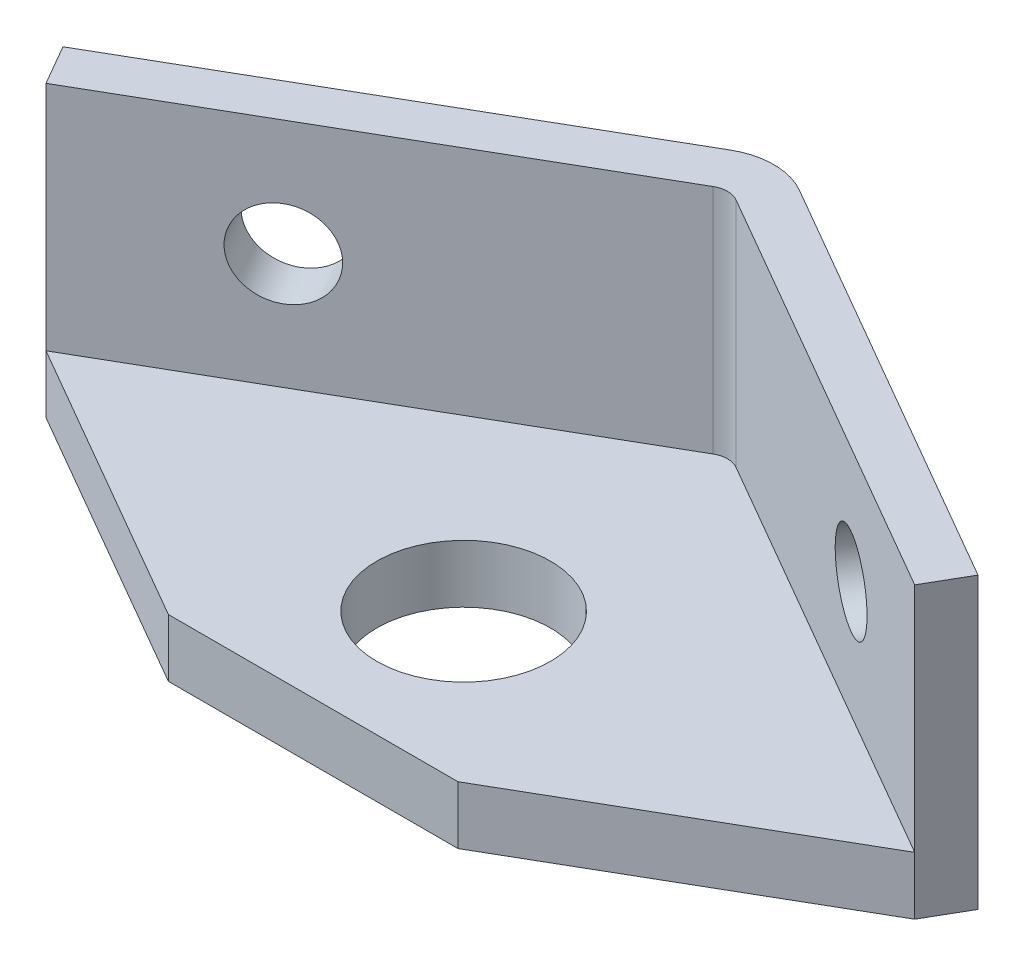
ISO-10303-21;
HEADER;
FILE_DESCRIPTION(('STEP AP214'),'2;1');
FILE_NAME('part.step','',(''),(''),'','','');
FILE_SCHEMA(('AUTOMOTIVE_DESIGN { 1 0 10303 214 1 1 1 1 }'));
ENDSEC;
DATA;
#1=APPLICATION_CONTEXT('core data for automotive mechanical design processes');
#2=APPLICATION_PROTOCOL_DEFINITION('international standard','automotive_design',2000,#1);
#3=PRODUCT_CONTEXT('',#1,'mechanical');
#4=PRODUCT('Part','Part','',(#3));
#5=PRODUCT_RELATED_PRODUCT_CATEGORY('part','',(#4));
#6=PRODUCT_DEFINITION_FORMATION('','',#4);
#7=PRODUCT_DEFINITION_CONTEXT('part definition',#1,'design');
#8=PRODUCT_DEFINITION('design','',#6,#7);
#9=PRODUCT_DEFINITION_SHAPE('','',#8);
#10=(LENGTH_UNIT() NAMED_UNIT(*) SI_UNIT(.MILLI.,.METRE.));
#11=(NAMED_UNIT(*) PLANE_ANGLE_UNIT() SI_UNIT($,.RADIAN.));
#12=(NAMED_UNIT(*) SI_UNIT($,.STERADIAN.) SOLID_ANGLE_UNIT());
#13=UNCERTAINTY_MEASURE_WITH_UNIT(LENGTH_MEASURE(1.E-05),#10,'distance_accuracy_value','');
#14=(GEOMETRIC_REPRESENTATION_CONTEXT(3) GLOBAL_UNCERTAINTY_ASSIGNED_CONTEXT((#13)) GLOBAL_UNIT_ASSIGNED_CONTEXT((#10,
#11,#12)) REPRESENTATION_CONTEXT('',''));
#15=CARTESIAN_POINT('',(0.,0.,0.));
#16=DIRECTION('',(0.,0.,1.));
#17=DIRECTION('',(1.,0.,0.));
#18=AXIS2_PLACEMENT_3D('',#15,#16,#17);
#19=CARTESIAN_POINT('',(-20.,50.,-34.6410161513775));
#20=DIRECTION('',(0.500000000000001,0.,0.866025403784438));
#21=DIRECTION('',(0.866025403784438,0.,-0.500000000000001));
#22=AXIS2_PLACEMENT_3D('',#19,#20,#21);
#23=PLANE('',#22);
#24=CARTESIAN_POINT('',(-49.0192378864667,30.,-17.8867513459482));
#25=DIRECTION('',(0.500000000000001,0.,0.866025403784438));
#26=DIRECTION('',(0.866025403784438,0.,-0.500000000000001));
#27=AXIS2_PLACEMENT_3D('',#24,#25,#26);
#28=CIRCLE('',#27,7.5);
#29=CARTESIAN_POINT('',(-42.5240473580834,30.,-21.6367513459482));
#30=VERTEX_POINT('',#29);
#31=EDGE_CURVE('E225',#30,#30,#28,.T.);
#32=ORIENTED_EDGE('',*,*,#31,.F.);
#33=EDGE_LOOP('',(#32));
#34=FACE_BOUND('',#33,.T.);
#35=DIRECTION('',(-0.866025403784438,0.,0.500000000000001));
#36=VECTOR('',#35,1.);
#37=CARTESIAN_POINT('',(-20.,10.,-34.6410161513775));
#38=LINE('',#37,#36);
#39=CARTESIAN_POINT('',(-2.00000000000001,10.,-45.0333209967908));
#40=VERTEX_POINT('',#39);
#41=CARTESIAN_POINT('',(-74.9999999999998,10.,-2.88675134594812));
#42=VERTEX_POINT('',#41);
#43=EDGE_CURVE('E188',#40,#42,#38,.T.);
#44=ORIENTED_EDGE('',*,*,#43,.F.);
#45=DIRECTION('',(0.,-1.,0.));
#46=VECTOR('',#45,1.);
#47=CARTESIAN_POINT('',(-2.00000000000001,50.,-45.0333209967908));
#48=LINE('',#47,#46);
#49=CARTESIAN_POINT('',(-2.00000000000001,50.,-45.0333209967908));
#50=VERTEX_POINT('',#49);
#51=EDGE_CURVE('E11',#50,#40,#48,.T.);
#52=ORIENTED_EDGE('',*,*,#51,.F.);
#53=DIRECTION('',(-0.866025403784438,0.,0.500000000000001));
#54=VECTOR('',#53,1.);
#55=CARTESIAN_POINT('',(-20.,50.,-34.6410161513775));
#56=LINE('',#55,#54);
#57=CARTESIAN_POINT('',(-74.9999999999998,50.,-2.88675134594812));
#58=VERTEX_POINT('',#57);
#59=EDGE_CURVE('E152',#50,#58,#56,.T.);
#60=ORIENTED_EDGE('',*,*,#59,.T.);
#61=DIRECTION('',(0.,-1.,0.));
#62=VECTOR('',#61,1.);
#63=CARTESIAN_POINT('',(-74.9999999999998,50.,-2.88675134594812));
#64=LINE('',#63,#62);
#65=EDGE_CURVE('E58',#58,#42,#64,.T.);
#66=ORIENTED_EDGE('',*,*,#65,.T.);
#67=EDGE_LOOP('',(#44,#52,#60,#66));
#68=FACE_BOUND('',#67,.T.);
#69=ADVANCED_FACE('F41',(#34,#68),#23,.T.);
#70=CARTESIAN_POINT('',(0.,50.,-41.5692193816531));
#71=DIRECTION('',(0.,-1.,0.));
#72=DIRECTION('',(0.,0.,-1.));
#73=AXIS2_PLACEMENT_3D('',#70,#71,#72);
#74=CYLINDRICAL_SURFACE('',#73,4.);
#75=ORIENTED_EDGE('',*,*,#51,.T.);
#76=CARTESIAN_POINT('',(0.,10.,-41.5692193816531));
#77=DIRECTION('',(0.,1.,0.));
#78=DIRECTION('',(0.,0.,1.));
#79=AXIS2_PLACEMENT_3D('',#76,#77,#78);
#80=CIRCLE('',#79,4.);
#81=CARTESIAN_POINT('',(2.00000000000001,10.,-45.0333209967908));
#82=VERTEX_POINT('',#81);
#83=EDGE_CURVE('E183',#40,#82,#80,.F.);
#84=ORIENTED_EDGE('',*,*,#83,.T.);
#85=DIRECTION('',(0.,-1.,0.));
#86=VECTOR('',#85,1.);
#87=CARTESIAN_POINT('',(2.00000000000001,50.,-45.0333209967908));
#88=LINE('',#87,#86);
#89=CARTESIAN_POINT('',(2.00000000000001,50.,-45.0333209967908));
#90=VERTEX_POINT('',#89);
#91=EDGE_CURVE('E50',#90,#82,#88,.T.);
#92=ORIENTED_EDGE('',*,*,#91,.F.);
#93=CARTESIAN_POINT('',(0.,50.,-41.5692193816531));
#94=DIRECTION('',(0.,1.,0.));
#95=DIRECTION('',(0.,0.,1.));
#96=AXIS2_PLACEMENT_3D('',#93,#94,#95);
#97=CIRCLE('',#96,4.);
#98=EDGE_CURVE('E181',#50,#90,#97,.F.);
#99=ORIENTED_EDGE('',*,*,#98,.F.);
#100=EDGE_LOOP('',(#75,#84,#92,#99));
#101=FACE_BOUND('',#100,.T.);
#102=ADVANCED_FACE('F180',(#101),#74,.F.);
#103=CARTESIAN_POINT('',(20.,50.,-34.6410161513775));
#104=DIRECTION('',(-0.500000000000001,0.,0.866025403784438));
#105=DIRECTION('',(0.866025403784438,0.,0.500000000000001));
#106=AXIS2_PLACEMENT_3D('',#103,#104,#105);
#107=PLANE('',#106);
#108=CARTESIAN_POINT('',(49.0192378864667,30.,-17.8867513459482));
#109=DIRECTION('',(-0.500000000000001,0.,0.866025403784438));
#110=DIRECTION('',(0.866025403784438,0.,0.500000000000001));
#111=AXIS2_PLACEMENT_3D('',#108,#109,#110);
#112=CIRCLE('',#111,7.5);
#113=CARTESIAN_POINT('',(55.51442841485,30.,-14.1367513459482));
#114=VERTEX_POINT('',#113);
#115=EDGE_CURVE('E316',#114,#114,#112,.T.);
#116=ORIENTED_EDGE('',*,*,#115,.F.);
#117=EDGE_LOOP('',(#116));
#118=FACE_BOUND('',#117,.T.);
#119=DIRECTION('',(-0.866025403784438,0.,-0.500000000000001));
#120=VECTOR('',#119,1.);
#121=CARTESIAN_POINT('',(20.,10.,-34.6410161513775));
#122=LINE('',#121,#120);
#123=CARTESIAN_POINT('',(74.9999999999998,10.,-2.88675134594812));
#124=VERTEX_POINT('',#123);
#125=EDGE_CURVE('E174',#124,#82,#122,.T.);
#126=ORIENTED_EDGE('',*,*,#125,.F.);
#127=DIRECTION('',(0.,-1.,0.));
#128=VECTOR('',#127,1.);
#129=CARTESIAN_POINT('',(74.9999999999998,50.,-2.88675134594812));
#130=LINE('',#129,#128);
#131=CARTESIAN_POINT('',(74.9999999999998,50.,-2.88675134594812));
#132=VERTEX_POINT('',#131);
#133=EDGE_CURVE('E162',#132,#124,#130,.T.);
#134=ORIENTED_EDGE('',*,*,#133,.F.);
#135=DIRECTION('',(-0.866025403784438,0.,-0.500000000000001));
#136=VECTOR('',#135,1.);
#137=CARTESIAN_POINT('',(20.,50.,-34.6410161513775));
#138=LINE('',#137,#136);
#139=EDGE_CURVE('E176',#132,#90,#138,.T.);
#140=ORIENTED_EDGE('',*,*,#139,.T.);
#141=ORIENTED_EDGE('',*,*,#91,.T.);
#142=EDGE_LOOP('',(#126,#134,#140,#141));
#143=FACE_BOUND('',#142,.T.);
#144=ADVANCED_FACE('F171',(#118,#143),#107,.T.);
#145=CARTESIAN_POINT('',(54.9999999999998,50.,31.7542648054294));
#146=DIRECTION('',(0.866025403784438,0.,0.500000000000001));
#147=DIRECTION('',(0.500000000000001,0.,-0.866025403784438));
#148=AXIS2_PLACEMENT_3D('',#145,#146,#147);
#149=PLANE('',#148);
#150=DIRECTION('',(-0.500000000000001,0.,0.866025403784438));
#151=VECTOR('',#150,1.);
#152=CARTESIAN_POINT('',(54.9999999999998,0.,31.7542648054294));
#153=LINE('',#152,#151);
#154=CARTESIAN_POINT('',(78.9999999999999,0.,-9.81495457622361));
#155=VERTEX_POINT('',#154);
#156=CARTESIAN_POINT('',(74.9999999999998,0.,-2.88675134594812));
#157=VERTEX_POINT('',#156);
#158=EDGE_CURVE('E134',#155,#157,#153,.T.);
#159=ORIENTED_EDGE('',*,*,#158,.F.);
#160=DIRECTION('',(0.,-1.,0.));
#161=VECTOR('',#160,1.);
#162=CARTESIAN_POINT('',(78.9999999999999,50.,-9.81495457622361));
#163=LINE('',#162,#161);
#164=CARTESIAN_POINT('',(78.9999999999999,50.,-9.81495457622361));
#165=VERTEX_POINT('',#164);
#166=EDGE_CURVE('E159',#165,#155,#163,.T.);
#167=ORIENTED_EDGE('',*,*,#166,.F.);
#168=DIRECTION('',(-0.500000000000001,0.,0.866025403784438));
#169=VECTOR('',#168,1.);
#170=CARTESIAN_POINT('',(54.9999999999998,50.,31.7542648054294));
#171=LINE('',#170,#169);
#172=EDGE_CURVE('E252',#165,#132,#171,.T.);
#173=ORIENTED_EDGE('',*,*,#172,.T.);
#174=ORIENTED_EDGE('',*,*,#133,.T.);
#175=DIRECTION('',(0.,-1.,0.));
#176=VECTOR('',#175,1.);
#177=CARTESIAN_POINT('',(74.9999999999998,10.,-2.88675134594812));
#178=LINE('',#177,#176);
#179=EDGE_CURVE('E219',#124,#157,#178,.T.);
#180=ORIENTED_EDGE('',*,*,#179,.T.);
#181=EDGE_LOOP('',(#159,#167,#173,#174,#180));
#182=FACE_BOUND('',#181,.T.);
#183=ADVANCED_FACE('F292',(#182),#149,.T.);
#184=CARTESIAN_POINT('',(24.,50.,-41.569219381653));
#185=DIRECTION('',(0.500000000000001,0.,-0.866025403784438));
#186=DIRECTION('',(-0.866025403784438,0.,-0.500000000000001));
#187=AXIS2_PLACEMENT_3D('',#184,#185,#186);
#188=PLANE('',#187);
#189=CARTESIAN_POINT('',(53.0192378864667,30.,-24.8149545762236));
#190=DIRECTION('',(0.500000000000001,0.,-0.866025403784438));
#191=DIRECTION('',(-0.866025403784438,0.,-0.500000000000001));
#192=AXIS2_PLACEMENT_3D('',#189,#190,#191);
#193=CIRCLE('',#192,7.5);
#194=CARTESIAN_POINT('',(46.5240473580834,30.,-28.5649545762237));
#195=VERTEX_POINT('',#194);
#196=EDGE_CURVE('E318',#195,#195,#193,.F.);
#197=ORIENTED_EDGE('',*,*,#196,.T.);
#198=EDGE_LOOP('',(#197));
#199=FACE_BOUND('',#198,.T.);
#200=DIRECTION('',(0.866025403784438,0.,0.500000000000001));
#201=VECTOR('',#200,1.);
#202=CARTESIAN_POINT('',(24.,0.,-41.569219381653));
#203=LINE('',#202,#201);
#204=CARTESIAN_POINT('',(6.,0.,-51.9615242270663));
#205=VERTEX_POINT('',#204);
#206=EDGE_CURVE('E138',#205,#155,#203,.T.);
#207=ORIENTED_EDGE('',*,*,#206,.F.);
#208=DIRECTION('',(0.,-1.,0.));
#209=VECTOR('',#208,1.);
#210=CARTESIAN_POINT('',(6.,50.,-51.9615242270663));
#211=LINE('',#210,#209);
#212=CARTESIAN_POINT('',(6.,50.,-51.9615242270663));
#213=VERTEX_POINT('',#212);
#214=EDGE_CURVE('E112',#213,#205,#211,.T.);
#215=ORIENTED_EDGE('',*,*,#214,.F.);
#216=DIRECTION('',(0.866025403784438,0.,0.500000000000001));
#217=VECTOR('',#216,1.);
#218=CARTESIAN_POINT('',(24.,50.,-41.569219381653));
#219=LINE('',#218,#217);
#220=EDGE_CURVE('E123',#213,#165,#219,.T.);
#221=ORIENTED_EDGE('',*,*,#220,.T.);
#222=ORIENTED_EDGE('',*,*,#166,.T.);
#223=EDGE_LOOP('',(#207,#215,#221,#222));
#224=FACE_BOUND('',#223,.T.);
#225=ADVANCED_FACE('F258',(#199,#224),#188,.T.);
#226=CARTESIAN_POINT('',(0.,50.,-41.5692193816531));
#227=DIRECTION('',(0.,-1.,0.));
#228=DIRECTION('',(0.,0.,-1.));
#229=AXIS2_PLACEMENT_3D('',#226,#227,#228);
#230=CYLINDRICAL_SURFACE('',#229,12.);
#231=CARTESIAN_POINT('',(0.,0.,-41.5692193816531));
#232=DIRECTION('',(0.,1.,0.));
#233=DIRECTION('',(0.,0.,1.));
#234=AXIS2_PLACEMENT_3D('',#231,#232,#233);
#235=CIRCLE('',#234,12.);
#236=CARTESIAN_POINT('',(-6.00000000000003,0.,-51.9615242270663));
#237=VERTEX_POINT('',#236);
#238=EDGE_CURVE('E109',#237,#205,#235,.F.);
#239=ORIENTED_EDGE('',*,*,#238,.F.);
#240=DIRECTION('',(0.,-1.,0.));
#241=VECTOR('',#240,1.);
#242=CARTESIAN_POINT('',(-6.00000000000003,50.,-51.9615242270663));
#243=LINE('',#242,#241);
#244=CARTESIAN_POINT('',(-6.00000000000003,50.,-51.9615242270663));
#245=VERTEX_POINT('',#244);
#246=EDGE_CURVE('E77',#245,#237,#243,.T.);
#247=ORIENTED_EDGE('',*,*,#246,.F.);
#248=CARTESIAN_POINT('',(0.,50.,-41.5692193816531));
#249=DIRECTION('',(0.,1.,0.));
#250=DIRECTION('',(0.,0.,1.));
#251=AXIS2_PLACEMENT_3D('',#248,#249,#250);
#252=CIRCLE('',#251,12.);
#253=EDGE_CURVE('E107',#245,#213,#252,.F.);
#254=ORIENTED_EDGE('',*,*,#253,.T.);
#255=ORIENTED_EDGE('',*,*,#214,.T.);
#256=EDGE_LOOP('',(#239,#247,#254,#255));
#257=FACE_BOUND('',#256,.T.);
#258=ADVANCED_FACE('F106',(#257),#230,.T.);
#259=CARTESIAN_POINT('',(-24.0000000000001,50.,-41.569219381653));
#260=DIRECTION('',(-0.500000000000001,0.,-0.866025403784438));
#261=DIRECTION('',(-0.866025403784438,0.,0.500000000000001));
#262=AXIS2_PLACEMENT_3D('',#259,#260,#261);
#263=PLANE('',#262);
#264=CARTESIAN_POINT('',(-53.0192378864667,30.,-24.8149545762237));
#265=DIRECTION('',(-0.500000000000001,0.,-0.866025403784438));
#266=DIRECTION('',(-0.866025403784438,0.,0.500000000000001));
#267=AXIS2_PLACEMENT_3D('',#264,#265,#266);
#268=CIRCLE('',#267,7.5);
#269=CARTESIAN_POINT('',(-59.51442841485,30.,-21.0649545762237));
#270=VERTEX_POINT('',#269);
#271=EDGE_CURVE('E199',#270,#270,#268,.F.);
#272=ORIENTED_EDGE('',*,*,#271,.T.);
#273=EDGE_LOOP('',(#272));
#274=FACE_BOUND('',#273,.T.);
#275=DIRECTION('',(0.866025403784438,0.,-0.500000000000001));
#276=VECTOR('',#275,1.);
#277=CARTESIAN_POINT('',(-24.0000000000001,0.,-41.569219381653));
#278=LINE('',#277,#276);
#279=CARTESIAN_POINT('',(-78.9999999999998,0.,-9.81495457622363));
#280=VERTEX_POINT('',#279);
#281=EDGE_CURVE('E145',#280,#237,#278,.T.);
#282=ORIENTED_EDGE('',*,*,#281,.F.);
#283=DIRECTION('',(0.,-1.,0.));
#284=VECTOR('',#283,1.);
#285=CARTESIAN_POINT('',(-78.9999999999998,50.,-9.81495457622363));
#286=LINE('',#285,#284);
#287=CARTESIAN_POINT('',(-78.9999999999998,50.,-9.81495457622363));
#288=VERTEX_POINT('',#287);
#289=EDGE_CURVE('E82',#288,#280,#286,.T.);
#290=ORIENTED_EDGE('',*,*,#289,.F.);
#291=DIRECTION('',(0.866025403784438,0.,-0.500000000000001));
#292=VECTOR('',#291,1.);
#293=CARTESIAN_POINT('',(-24.0000000000001,50.,-41.569219381653));
#294=LINE('',#293,#292);
#295=EDGE_CURVE('E120',#288,#245,#294,.T.);
#296=ORIENTED_EDGE('',*,*,#295,.T.);
#297=ORIENTED_EDGE('',*,*,#246,.T.);
#298=EDGE_LOOP('',(#282,#290,#296,#297));
#299=FACE_BOUND('',#298,.T.);
#300=ADVANCED_FACE('F126',(#274,#299),#263,.T.);
#301=CARTESIAN_POINT('',(-54.9999999999998,50.,31.7542648054294));
#302=DIRECTION('',(-0.866025403784438,0.,0.500000000000001));
#303=DIRECTION('',(0.500000000000001,0.,0.866025403784438));
#304=AXIS2_PLACEMENT_3D('',#301,#302,#303);
#305=PLANE('',#304);
#306=DIRECTION('',(-0.500000000000001,0.,-0.866025403784438));
#307=VECTOR('',#306,1.);
#308=CARTESIAN_POINT('',(-54.9999999999998,0.,31.7542648054294));
#309=LINE('',#308,#307);
#310=CARTESIAN_POINT('',(-74.9999999999998,0.,-2.88675134594812));
#311=VERTEX_POINT('',#310);
#312=EDGE_CURVE('E148',#311,#280,#309,.T.);
#313=ORIENTED_EDGE('',*,*,#312,.F.);
#314=DIRECTION('',(0.,-1.,0.));
#315=VECTOR('',#314,1.);
#316=CARTESIAN_POINT('',(-74.9999999999998,10.,-2.88675134594812));
#317=LINE('',#316,#315);
#318=EDGE_CURVE('E139',#42,#311,#317,.T.);
#319=ORIENTED_EDGE('',*,*,#318,.F.);
#320=ORIENTED_EDGE('',*,*,#65,.F.);
#321=DIRECTION('',(-0.500000000000001,0.,-0.866025403784438));
#322=VECTOR('',#321,1.);
#323=CARTESIAN_POINT('',(-54.9999999999998,50.,31.7542648054294));
#324=LINE('',#323,#322);
#325=EDGE_CURVE('E128',#58,#288,#324,.T.);
#326=ORIENTED_EDGE('',*,*,#325,.T.);
#327=ORIENTED_EDGE('',*,*,#289,.T.);
#328=EDGE_LOOP('',(#313,#319,#320,#326,#327));
#329=FACE_BOUND('',#328,.T.);
#330=ADVANCED_FACE('F266',(#329),#305,.T.);
#331=CARTESIAN_POINT('',(0.,50.,0.));
#332=DIRECTION('',(0.,1.,0.));
#333=DIRECTION('',(0.,0.,1.));
#334=AXIS2_PLACEMENT_3D('',#331,#332,#333);
#335=PLANE('',#334);
#336=ORIENTED_EDGE('',*,*,#59,.F.);
#337=ORIENTED_EDGE('',*,*,#98,.T.);
#338=ORIENTED_EDGE('',*,*,#139,.F.);
#339=ORIENTED_EDGE('',*,*,#172,.F.);
#340=ORIENTED_EDGE('',*,*,#220,.F.);
#341=ORIENTED_EDGE('',*,*,#253,.F.);
#342=ORIENTED_EDGE('',*,*,#295,.F.);
#343=ORIENTED_EDGE('',*,*,#325,.F.);
#344=EDGE_LOOP('',(#336,#337,#338,#339,#340,#341,#342,#343));
#345=FACE_BOUND('',#344,.T.);
#346=ADVANCED_FACE('F118',(#345),#335,.T.);
#347=CARTESIAN_POINT('',(0.,0.,0.));
#348=DIRECTION('',(0.,1.,0.));
#349=DIRECTION('',(0.,0.,1.));
#350=AXIS2_PLACEMENT_3D('',#347,#348,#349);
#351=PLANE('',#350);
#352=DIRECTION('',(0.866025403784438,0.,0.500000000000001));
#353=VECTOR('',#352,1.);
#354=CARTESIAN_POINT('',(-17.5,0.,30.3108891324553));
#355=LINE('',#354,#353);
#356=CARTESIAN_POINT('',(-25.,0.,25.9807621135332));
#357=VERTEX_POINT('',#356);
#358=EDGE_CURVE('E220',#311,#357,#355,.T.);
#359=ORIENTED_EDGE('',*,*,#358,.F.);
#360=ORIENTED_EDGE('',*,*,#312,.T.);
#361=ORIENTED_EDGE('',*,*,#281,.T.);
#362=ORIENTED_EDGE('',*,*,#238,.T.);
#363=ORIENTED_EDGE('',*,*,#206,.T.);
#364=ORIENTED_EDGE('',*,*,#158,.T.);
#365=DIRECTION('',(0.866025403784438,0.,-0.500000000000001));
#366=VECTOR('',#365,1.);
#367=CARTESIAN_POINT('',(17.5,0.,30.3108891324553));
#368=LINE('',#367,#366);
#369=CARTESIAN_POINT('',(25.,0.,25.9807621135332));
#370=VERTEX_POINT('',#369);
#371=EDGE_CURVE('E196',#370,#157,#368,.T.);
#372=ORIENTED_EDGE('',*,*,#371,.F.);
#373=DIRECTION('',(1.,0.,0.));
#374=VECTOR('',#373,1.);
#375=CARTESIAN_POINT('',(0.,0.,25.9807621135332));
#376=LINE('',#375,#374);
#377=EDGE_CURVE('E224',#357,#370,#376,.T.);
#378=ORIENTED_EDGE('',*,*,#377,.F.);
#379=EDGE_LOOP('',(#359,#360,#361,#362,#363,#364,#372,#378));
#380=FACE_BOUND('',#379,.T.);
#381=CARTESIAN_POINT('',(0.,0.,0.));
#382=DIRECTION('',(0.,1.,0.));
#383=DIRECTION('',(0.,0.,1.));
#384=AXIS2_PLACEMENT_3D('',#381,#382,#383);
#385=CIRCLE('',#384,15.);
#386=CARTESIAN_POINT('',(0.,0.,15.));
#387=VERTEX_POINT('',#386);
#388=EDGE_CURVE('E189',#387,#387,#385,.T.);
#389=ORIENTED_EDGE('',*,*,#388,.T.);
#390=EDGE_LOOP('',(#389));
#391=FACE_BOUND('',#390,.T.);
#392=ADVANCED_FACE('F262',(#380,#391),#351,.F.);
#393=CARTESIAN_POINT('',(-17.5,10.,30.3108891324553));
#394=DIRECTION('',(0.500000000000001,0.,-0.866025403784438));
#395=DIRECTION('',(-0.866025403784438,0.,-0.500000000000001));
#396=AXIS2_PLACEMENT_3D('',#393,#394,#395);
#397=PLANE('',#396);
#398=ORIENTED_EDGE('',*,*,#358,.T.);
#399=DIRECTION('',(0.,-1.,0.));
#400=VECTOR('',#399,1.);
#401=CARTESIAN_POINT('',(-25.,10.,25.9807621135332));
#402=LINE('',#401,#400);
#403=CARTESIAN_POINT('',(-25.,10.,25.9807621135332));
#404=VERTEX_POINT('',#403);
#405=EDGE_CURVE('E239',#404,#357,#402,.T.);
#406=ORIENTED_EDGE('',*,*,#405,.F.);
#407=DIRECTION('',(0.866025403784438,0.,0.500000000000001));
#408=VECTOR('',#407,1.);
#409=CARTESIAN_POINT('',(-17.5,10.,30.3108891324553));
#410=LINE('',#409,#408);
#411=EDGE_CURVE('E193',#42,#404,#410,.T.);
#412=ORIENTED_EDGE('',*,*,#411,.F.);
#413=ORIENTED_EDGE('',*,*,#318,.T.);
#414=EDGE_LOOP('',(#398,#406,#412,#413));
#415=FACE_BOUND('',#414,.T.);
#416=ADVANCED_FACE('F294',(#415),#397,.F.);
#417=CARTESIAN_POINT('',(0.,10.,25.9807621135332));
#418=DIRECTION('',(0.,0.,-1.));
#419=DIRECTION('',(-1.,0.,0.));
#420=AXIS2_PLACEMENT_3D('',#417,#418,#419);
#421=PLANE('',#420);
#422=ORIENTED_EDGE('',*,*,#377,.T.);
#423=DIRECTION('',(0.,-1.,0.));
#424=VECTOR('',#423,1.);
#425=CARTESIAN_POINT('',(25.,10.,25.9807621135332));
#426=LINE('',#425,#424);
#427=CARTESIAN_POINT('',(25.,10.,25.9807621135332));
#428=VERTEX_POINT('',#427);
#429=EDGE_CURVE('E235',#428,#370,#426,.T.);
#430=ORIENTED_EDGE('',*,*,#429,.F.);
#431=DIRECTION('',(1.,0.,0.));
#432=VECTOR('',#431,1.);
#433=CARTESIAN_POINT('',(0.,10.,25.9807621135332));
#434=LINE('',#433,#432);
#435=EDGE_CURVE('E205',#404,#428,#434,.T.);
#436=ORIENTED_EDGE('',*,*,#435,.F.);
#437=ORIENTED_EDGE('',*,*,#405,.T.);
#438=EDGE_LOOP('',(#422,#430,#436,#437));
#439=FACE_BOUND('',#438,.T.);
#440=ADVANCED_FACE('F295',(#439),#421,.F.);
#441=CARTESIAN_POINT('',(17.5,10.,30.3108891324553));
#442=DIRECTION('',(-0.500000000000001,0.,-0.866025403784438));
#443=DIRECTION('',(-0.866025403784438,0.,0.500000000000001));
#444=AXIS2_PLACEMENT_3D('',#441,#442,#443);
#445=PLANE('',#444);
#446=ORIENTED_EDGE('',*,*,#371,.T.);
#447=ORIENTED_EDGE('',*,*,#179,.F.);
#448=DIRECTION('',(0.866025403784438,0.,-0.500000000000001));
#449=VECTOR('',#448,1.);
#450=CARTESIAN_POINT('',(17.5,10.,30.3108891324553));
#451=LINE('',#450,#449);
#452=EDGE_CURVE('E209',#428,#124,#451,.T.);
#453=ORIENTED_EDGE('',*,*,#452,.F.);
#454=ORIENTED_EDGE('',*,*,#429,.T.);
#455=EDGE_LOOP('',(#446,#447,#453,#454));
#456=FACE_BOUND('',#455,.T.);
#457=ADVANCED_FACE('F290',(#456),#445,.F.);
#458=CARTESIAN_POINT('',(0.,10.,0.));
#459=DIRECTION('',(0.,-1.,0.));
#460=DIRECTION('',(0.,0.,-1.));
#461=AXIS2_PLACEMENT_3D('',#458,#459,#460);
#462=CYLINDRICAL_SURFACE('',#461,15.);
#463=CARTESIAN_POINT('',(0.,10.,0.));
#464=DIRECTION('',(0.,1.,0.));
#465=DIRECTION('',(0.,0.,1.));
#466=AXIS2_PLACEMENT_3D('',#463,#464,#465);
#467=CIRCLE('',#466,15.);
#468=CARTESIAN_POINT('',(0.,10.,15.));
#469=VERTEX_POINT('',#468);
#470=EDGE_CURVE('E215',#469,#469,#467,.T.);
#471=ORIENTED_EDGE('',*,*,#470,.T.);
#472=EDGE_LOOP('',(#471));
#473=FACE_BOUND('',#472,.T.);
#474=ORIENTED_EDGE('',*,*,#388,.F.);
#475=EDGE_LOOP('',(#474));
#476=FACE_BOUND('',#475,.T.);
#477=ADVANCED_FACE('F302',(#473,#476),#462,.F.);
#478=CARTESIAN_POINT('',(0.,10.,0.));
#479=DIRECTION('',(0.,1.,0.));
#480=DIRECTION('',(0.,0.,1.));
#481=AXIS2_PLACEMENT_3D('',#478,#479,#480);
#482=PLANE('',#481);
#483=ORIENTED_EDGE('',*,*,#83,.F.);
#484=ORIENTED_EDGE('',*,*,#43,.T.);
#485=ORIENTED_EDGE('',*,*,#411,.T.);
#486=ORIENTED_EDGE('',*,*,#435,.T.);
#487=ORIENTED_EDGE('',*,*,#452,.T.);
#488=ORIENTED_EDGE('',*,*,#125,.T.);
#489=EDGE_LOOP('',(#483,#484,#485,#486,#487,#488));
#490=FACE_BOUND('',#489,.T.);
#491=ORIENTED_EDGE('',*,*,#470,.F.);
#492=EDGE_LOOP('',(#491));
#493=FACE_BOUND('',#492,.T.);
#494=ADVANCED_FACE('F287',(#490,#493),#482,.T.);
#495=CARTESIAN_POINT('',(-71.9660733218753,30.,-57.6318361929976));
#496=DIRECTION('',(0.500000000000001,0.,0.866025403784438));
#497=DIRECTION('',(0.866025403784438,0.,-0.500000000000001));
#498=AXIS2_PLACEMENT_3D('',#495,#496,#497);
#499=CYLINDRICAL_SURFACE('',#498,7.5);
#500=ORIENTED_EDGE('',*,*,#271,.F.);
#501=EDGE_LOOP('',(#500));
#502=FACE_BOUND('',#501,.T.);
#503=ORIENTED_EDGE('',*,*,#31,.T.);
#504=EDGE_LOOP('',(#503));
#505=FACE_BOUND('',#504,.T.);
#506=ADVANCED_FACE('F389',(#502,#505),#499,.F.);
#507=CARTESIAN_POINT('',(71.9660733218753,30.,-57.6318361929976));
#508=DIRECTION('',(-0.500000000000001,0.,0.866025403784438));
#509=DIRECTION('',(0.866025403784438,0.,0.500000000000001));
#510=AXIS2_PLACEMENT_3D('',#507,#508,#509);
#511=CYLINDRICAL_SURFACE('',#510,7.5);
#512=ORIENTED_EDGE('',*,*,#196,.F.);
#513=EDGE_LOOP('',(#512));
#514=FACE_BOUND('',#513,.T.);
#515=ORIENTED_EDGE('',*,*,#115,.T.);
#516=EDGE_LOOP('',(#515));
#517=FACE_BOUND('',#516,.T.);
#518=ADVANCED_FACE('F326',(#514,#517),#511,.F.);
#519=CLOSED_SHELL('',(#69,#102,#144,#183,#225,#258,#300,#330,#346,#392,#416,#440,#457,#477,#494,
#506,#518));
#520=MANIFOLD_SOLID_BREP('B2',#519);
#521=ADVANCED_BREP_SHAPE_REPRESENTATION('',(#18,#520),#14);
#522=SHAPE_DEFINITION_REPRESENTATION(#9,#521);
ENDSEC;
END-ISO-10303-21;
